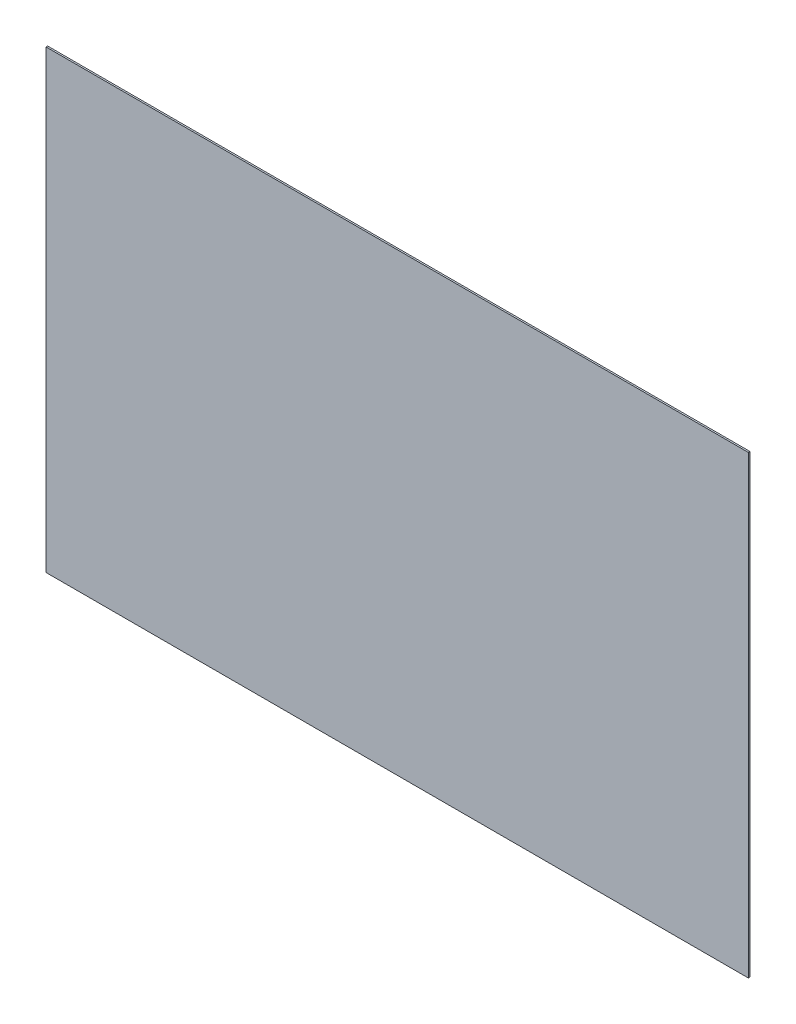
ISO-10303-21;
HEADER;
FILE_DESCRIPTION(('STEP AP214'),'2;1');
FILE_NAME('part.step','',(''),(''),'','','');
FILE_SCHEMA(('AUTOMOTIVE_DESIGN { 1 0 10303 214 1 1 1 1 }'));
ENDSEC;
DATA;
#1=APPLICATION_CONTEXT('core data for automotive mechanical design processes');
#2=APPLICATION_PROTOCOL_DEFINITION('international standard','automotive_design',2000,#1);
#3=PRODUCT_CONTEXT('',#1,'mechanical');
#4=PRODUCT('Part','Part','',(#3));
#5=PRODUCT_RELATED_PRODUCT_CATEGORY('part','',(#4));
#6=PRODUCT_DEFINITION_FORMATION('','',#4);
#7=PRODUCT_DEFINITION_CONTEXT('part definition',#1,'design');
#8=PRODUCT_DEFINITION('design','',#6,#7);
#9=PRODUCT_DEFINITION_SHAPE('','',#8);
#10=(LENGTH_UNIT() NAMED_UNIT(*) SI_UNIT(.MILLI.,.METRE.));
#11=(NAMED_UNIT(*) PLANE_ANGLE_UNIT() SI_UNIT($,.RADIAN.));
#12=(NAMED_UNIT(*) SI_UNIT($,.STERADIAN.) SOLID_ANGLE_UNIT());
#13=UNCERTAINTY_MEASURE_WITH_UNIT(LENGTH_MEASURE(1.E-05),#10,'distance_accuracy_value','');
#14=(GEOMETRIC_REPRESENTATION_CONTEXT(3) GLOBAL_UNCERTAINTY_ASSIGNED_CONTEXT((#13)) GLOBAL_UNIT_ASSIGNED_CONTEXT((#10,
#11,#12)) REPRESENTATION_CONTEXT('',''));
#15=CARTESIAN_POINT('',(0.,0.,0.));
#16=DIRECTION('',(0.,0.,1.));
#17=DIRECTION('',(1.,0.,0.));
#18=AXIS2_PLACEMENT_3D('',#15,#16,#17);
#19=CARTESIAN_POINT('',(0.,0.,1.5875));
#20=DIRECTION('',(-1.,0.,0.));
#21=DIRECTION('',(0.,0.,1.));
#22=AXIS2_PLACEMENT_3D('',#19,#20,#21);
#23=PLANE('',#22);
#24=DIRECTION('',(0.,1.,0.));
#25=VECTOR('',#24,1.);
#26=CARTESIAN_POINT('',(0.,0.,0.));
#27=LINE('',#26,#25);
#28=CARTESIAN_POINT('',(0.,0.,0.));
#29=VERTEX_POINT('',#28);
#30=CARTESIAN_POINT('',(0.,444.5,0.));
#31=VERTEX_POINT('',#30);
#32=EDGE_CURVE('E96',#29,#31,#27,.T.);
#33=ORIENTED_EDGE('',*,*,#32,.T.);
#34=DIRECTION('',(0.,0.,-1.));
#35=VECTOR('',#34,1.);
#36=CARTESIAN_POINT('',(0.,444.5,1.5875));
#37=LINE('',#36,#35);
#38=CARTESIAN_POINT('',(0.,444.5,1.5875));
#39=VERTEX_POINT('',#38);
#40=EDGE_CURVE('E11',#39,#31,#37,.T.);
#41=ORIENTED_EDGE('',*,*,#40,.F.);
#42=DIRECTION('',(0.,1.,0.));
#43=VECTOR('',#42,1.);
#44=CARTESIAN_POINT('',(0.,0.,1.5875));
#45=LINE('',#44,#43);
#46=CARTESIAN_POINT('',(0.,0.,1.5875));
#47=VERTEX_POINT('',#46);
#48=EDGE_CURVE('E84',#47,#39,#45,.T.);
#49=ORIENTED_EDGE('',*,*,#48,.F.);
#50=DIRECTION('',(0.,0.,-1.));
#51=VECTOR('',#50,1.);
#52=CARTESIAN_POINT('',(0.,0.,1.5875));
#53=LINE('',#52,#51);
#54=EDGE_CURVE('E92',#47,#29,#53,.T.);
#55=ORIENTED_EDGE('',*,*,#54,.T.);
#56=EDGE_LOOP('',(#33,#41,#49,#55));
#57=FACE_BOUND('',#56,.T.);
#58=ADVANCED_FACE('F33',(#57),#23,.F.);
#59=CARTESIAN_POINT('',(0.,444.5,1.5875));
#60=DIRECTION('',(0.,-1.,0.));
#61=DIRECTION('',(1.,0.,0.));
#62=AXIS2_PLACEMENT_3D('',#59,#60,#61);
#63=PLANE('',#62);
#64=DIRECTION('',(-1.,0.,0.));
#65=VECTOR('',#64,1.);
#66=CARTESIAN_POINT('',(0.,444.5,0.));
#67=LINE('',#66,#65);
#68=CARTESIAN_POINT('',(-685.8,444.5,0.));
#69=VERTEX_POINT('',#68);
#70=EDGE_CURVE('E88',#31,#69,#67,.T.);
#71=ORIENTED_EDGE('',*,*,#70,.T.);
#72=DIRECTION('',(0.,0.,-1.));
#73=VECTOR('',#72,1.);
#74=CARTESIAN_POINT('',(-685.8,444.5,1.5875));
#75=LINE('',#74,#73);
#76=CARTESIAN_POINT('',(-685.8,444.5,1.5875));
#77=VERTEX_POINT('',#76);
#78=EDGE_CURVE('E41',#77,#69,#75,.T.);
#79=ORIENTED_EDGE('',*,*,#78,.F.);
#80=DIRECTION('',(-1.,0.,0.));
#81=VECTOR('',#80,1.);
#82=CARTESIAN_POINT('',(0.,444.5,1.5875));
#83=LINE('',#82,#81);
#84=EDGE_CURVE('E79',#39,#77,#83,.T.);
#85=ORIENTED_EDGE('',*,*,#84,.F.);
#86=ORIENTED_EDGE('',*,*,#40,.T.);
#87=EDGE_LOOP('',(#71,#79,#85,#86));
#88=FACE_BOUND('',#87,.T.);
#89=ADVANCED_FACE('F87',(#88),#63,.F.);
#90=CARTESIAN_POINT('',(-685.8,0.,1.5875));
#91=DIRECTION('',(1.,0.,0.));
#92=DIRECTION('',(0.,0.,-1.));
#93=AXIS2_PLACEMENT_3D('',#90,#91,#92);
#94=PLANE('',#93);
#95=DIRECTION('',(0.,-1.,0.));
#96=VECTOR('',#95,1.);
#97=CARTESIAN_POINT('',(-685.8,0.,0.));
#98=LINE('',#97,#96);
#99=CARTESIAN_POINT('',(-685.8,0.,0.));
#100=VERTEX_POINT('',#99);
#101=EDGE_CURVE('E66',#69,#100,#98,.T.);
#102=ORIENTED_EDGE('',*,*,#101,.T.);
#103=DIRECTION('',(0.,0.,-1.));
#104=VECTOR('',#103,1.);
#105=CARTESIAN_POINT('',(-685.8,0.,1.5875));
#106=LINE('',#105,#104);
#107=CARTESIAN_POINT('',(-685.8,0.,1.5875));
#108=VERTEX_POINT('',#107);
#109=EDGE_CURVE('E89',#108,#100,#106,.T.);
#110=ORIENTED_EDGE('',*,*,#109,.F.);
#111=DIRECTION('',(0.,-1.,0.));
#112=VECTOR('',#111,1.);
#113=CARTESIAN_POINT('',(-685.8,0.,1.5875));
#114=LINE('',#113,#112);
#115=EDGE_CURVE('E82',#77,#108,#114,.T.);
#116=ORIENTED_EDGE('',*,*,#115,.F.);
#117=ORIENTED_EDGE('',*,*,#78,.T.);
#118=EDGE_LOOP('',(#102,#110,#116,#117));
#119=FACE_BOUND('',#118,.T.);
#120=ADVANCED_FACE('F90',(#119),#94,.F.);
#121=CARTESIAN_POINT('',(0.,0.,1.5875));
#122=DIRECTION('',(0.,1.,0.));
#123=DIRECTION('',(-1.,0.,0.));
#124=AXIS2_PLACEMENT_3D('',#121,#122,#123);
#125=PLANE('',#124);
#126=DIRECTION('',(1.,0.,0.));
#127=VECTOR('',#126,1.);
#128=CARTESIAN_POINT('',(0.,0.,0.));
#129=LINE('',#128,#127);
#130=EDGE_CURVE('E72',#100,#29,#129,.T.);
#131=ORIENTED_EDGE('',*,*,#130,.T.);
#132=ORIENTED_EDGE('',*,*,#54,.F.);
#133=DIRECTION('',(1.,0.,0.));
#134=VECTOR('',#133,1.);
#135=CARTESIAN_POINT('',(0.,0.,1.5875));
#136=LINE('',#135,#134);
#137=EDGE_CURVE('E49',#108,#47,#136,.T.);
#138=ORIENTED_EDGE('',*,*,#137,.F.);
#139=ORIENTED_EDGE('',*,*,#109,.T.);
#140=EDGE_LOOP('',(#131,#132,#138,#139));
#141=FACE_BOUND('',#140,.T.);
#142=ADVANCED_FACE('F103',(#141),#125,.F.);
#143=CARTESIAN_POINT('',(0.,0.,1.5875));
#144=DIRECTION('',(0.,0.,1.));
#145=DIRECTION('',(1.,0.,0.));
#146=AXIS2_PLACEMENT_3D('',#143,#144,#145);
#147=PLANE('',#146);
#148=ORIENTED_EDGE('',*,*,#48,.T.);
#149=ORIENTED_EDGE('',*,*,#84,.T.);
#150=ORIENTED_EDGE('',*,*,#115,.T.);
#151=ORIENTED_EDGE('',*,*,#137,.T.);
#152=EDGE_LOOP('',(#148,#149,#150,#151));
#153=FACE_BOUND('',#152,.T.);
#154=ADVANCED_FACE('F80',(#153),#147,.T.);
#155=CARTESIAN_POINT('',(0.,0.,0.));
#156=DIRECTION('',(0.,0.,1.));
#157=DIRECTION('',(1.,0.,0.));
#158=AXIS2_PLACEMENT_3D('',#155,#156,#157);
#159=PLANE('',#158);
#160=ORIENTED_EDGE('',*,*,#32,.F.);
#161=ORIENTED_EDGE('',*,*,#130,.F.);
#162=ORIENTED_EDGE('',*,*,#101,.F.);
#163=ORIENTED_EDGE('',*,*,#70,.F.);
#164=EDGE_LOOP('',(#160,#161,#162,#163));
#165=FACE_BOUND('',#164,.T.);
#166=ADVANCED_FACE('F106',(#165),#159,.F.);
#167=CLOSED_SHELL('',(#58,#89,#120,#142,#154,#166));
#168=MANIFOLD_SOLID_BREP('B2',#167);
#169=ADVANCED_BREP_SHAPE_REPRESENTATION('',(#18,#168),#14);
#170=SHAPE_DEFINITION_REPRESENTATION(#9,#169);
ENDSEC;
END-ISO-10303-21;
